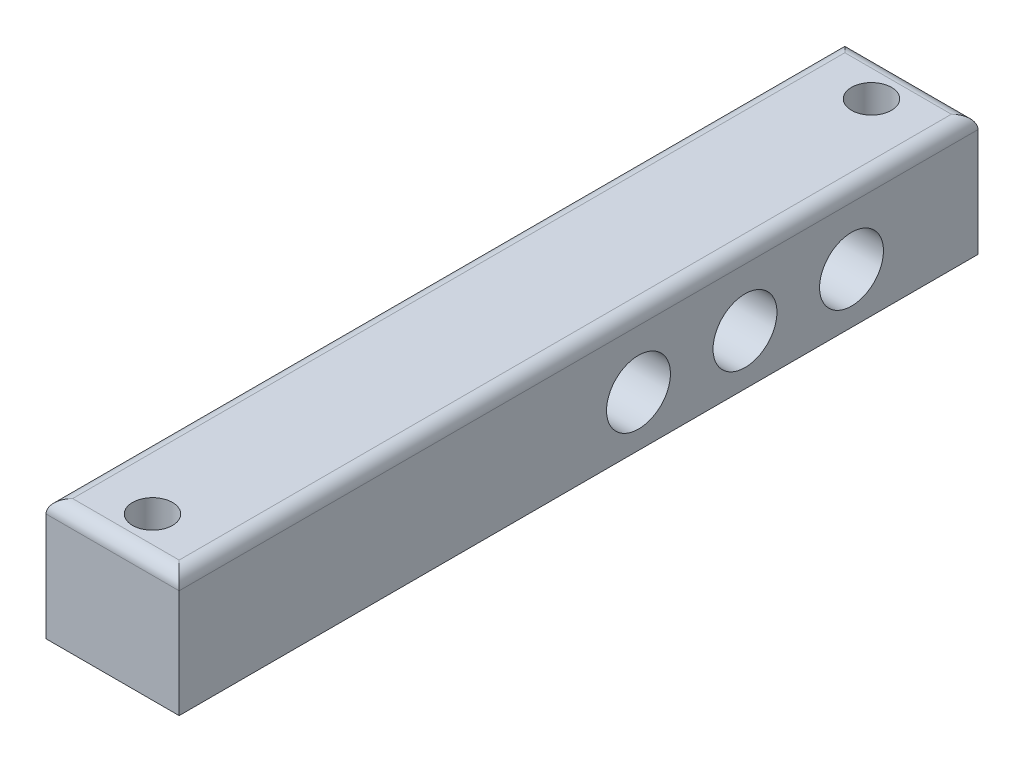
ISO-10303-21;
HEADER;
FILE_DESCRIPTION(('STEP AP214'),'2;1');
FILE_NAME('part.step','',(''),(''),'','','');
FILE_SCHEMA(('AUTOMOTIVE_DESIGN { 1 0 10303 214 1 1 1 1 }'));
ENDSEC;
DATA;
#1=APPLICATION_CONTEXT('core data for automotive mechanical design processes');
#2=APPLICATION_PROTOCOL_DEFINITION('international standard','automotive_design',2000,#1);
#3=PRODUCT_CONTEXT('',#1,'mechanical');
#4=PRODUCT('Part','Part','',(#3));
#5=PRODUCT_RELATED_PRODUCT_CATEGORY('part','',(#4));
#6=PRODUCT_DEFINITION_FORMATION('','',#4);
#7=PRODUCT_DEFINITION_CONTEXT('part definition',#1,'design');
#8=PRODUCT_DEFINITION('design','',#6,#7);
#9=PRODUCT_DEFINITION_SHAPE('','',#8);
#10=(LENGTH_UNIT() NAMED_UNIT(*) SI_UNIT(.MILLI.,.METRE.));
#11=(NAMED_UNIT(*) PLANE_ANGLE_UNIT() SI_UNIT($,.RADIAN.));
#12=(NAMED_UNIT(*) SI_UNIT($,.STERADIAN.) SOLID_ANGLE_UNIT());
#13=UNCERTAINTY_MEASURE_WITH_UNIT(LENGTH_MEASURE(1.E-05),#10,'distance_accuracy_value','');
#14=(GEOMETRIC_REPRESENTATION_CONTEXT(3) GLOBAL_UNCERTAINTY_ASSIGNED_CONTEXT((#13)) GLOBAL_UNIT_ASSIGNED_CONTEXT((#10,
#11,#12)) REPRESENTATION_CONTEXT('',''));
#15=CARTESIAN_POINT('',(0.,0.,0.));
#16=DIRECTION('',(0.,0.,1.));
#17=DIRECTION('',(1.,0.,0.));
#18=AXIS2_PLACEMENT_3D('',#15,#16,#17);
#19=CARTESIAN_POINT('',(-10.,9.12,0.));
#20=DIRECTION('',(1.,0.,0.));
#21=DIRECTION('',(0.,0.,-1.));
#22=AXIS2_PLACEMENT_3D('',#19,#20,#21);
#23=PLANE('',#22);
#24=CARTESIAN_POINT('',(-10.,3.79,25.5));
#25=DIRECTION('',(-1.,0.,0.));
#26=DIRECTION('',(0.,0.,1.));
#27=AXIS2_PLACEMENT_3D('',#24,#25,#26);
#28=CIRCLE('',#27,2.4);
#29=CARTESIAN_POINT('',(-10.,3.79,27.9));
#30=VERTEX_POINT('',#29);
#31=EDGE_CURVE('E159',#30,#30,#28,.T.);
#32=ORIENTED_EDGE('',*,*,#31,.F.);
#33=EDGE_LOOP('',(#32));
#34=FACE_BOUND('',#33,.T.);
#35=CARTESIAN_POINT('',(-10.,3.79,9.5));
#36=DIRECTION('',(-1.,0.,0.));
#37=DIRECTION('',(0.,0.,1.));
#38=AXIS2_PLACEMENT_3D('',#35,#36,#37);
#39=CIRCLE('',#38,2.4);
#40=CARTESIAN_POINT('',(-10.,3.79,11.9));
#41=VERTEX_POINT('',#40);
#42=EDGE_CURVE('E165',#41,#41,#39,.T.);
#43=ORIENTED_EDGE('',*,*,#42,.F.);
#44=EDGE_LOOP('',(#43));
#45=FACE_BOUND('',#44,.T.);
#46=CARTESIAN_POINT('',(-10.,3.79,17.5));
#47=DIRECTION('',(-1.,0.,0.));
#48=DIRECTION('',(0.,0.,1.));
#49=AXIS2_PLACEMENT_3D('',#46,#47,#48);
#50=CIRCLE('',#49,2.4);
#51=CARTESIAN_POINT('',(-10.,3.79,19.9));
#52=VERTEX_POINT('',#51);
#53=EDGE_CURVE('E111',#52,#52,#50,.T.);
#54=ORIENTED_EDGE('',*,*,#53,.F.);
#55=EDGE_LOOP('',(#54));
#56=FACE_BOUND('',#55,.T.);
#57=DIRECTION('',(0.,-1.,0.));
#58=VECTOR('',#57,1.);
#59=CARTESIAN_POINT('',(-9.99999999999999,9.12,60.));
#60=LINE('',#59,#58);
#61=CARTESIAN_POINT('',(-9.99999999999999,8.12,60.));
#62=VERTEX_POINT('',#61);
#63=CARTESIAN_POINT('',(-9.99999999999999,0.,60.));
#64=VERTEX_POINT('',#63);
#65=EDGE_CURVE('E86',#62,#64,#60,.T.);
#66=ORIENTED_EDGE('',*,*,#65,.F.);
#67=DIRECTION('',(0.,0.,1.));
#68=VECTOR('',#67,1.);
#69=CARTESIAN_POINT('',(-10.,8.12,0.));
#70=LINE('',#69,#68);
#71=CARTESIAN_POINT('',(-10.,8.12,0.));
#72=VERTEX_POINT('',#71);
#73=EDGE_CURVE('E11',#62,#72,#70,.F.);
#74=ORIENTED_EDGE('',*,*,#73,.T.);
#75=DIRECTION('',(0.,-1.,0.));
#76=VECTOR('',#75,1.);
#77=CARTESIAN_POINT('',(-10.,9.12,0.));
#78=LINE('',#77,#76);
#79=CARTESIAN_POINT('',(-10.,0.,0.));
#80=VERTEX_POINT('',#79);
#81=EDGE_CURVE('E106',#72,#80,#78,.T.);
#82=ORIENTED_EDGE('',*,*,#81,.T.);
#83=DIRECTION('',(0.,0.,1.));
#84=VECTOR('',#83,1.);
#85=CARTESIAN_POINT('',(-10.,0.,0.));
#86=LINE('',#85,#84);
#87=EDGE_CURVE('E102',#80,#64,#86,.T.);
#88=ORIENTED_EDGE('',*,*,#87,.T.);
#89=EDGE_LOOP('',(#66,#74,#82,#88));
#90=FACE_BOUND('',#89,.T.);
#91=ADVANCED_FACE('F32',(#34,#45,#56,#90),#23,.F.);
#92=CARTESIAN_POINT('',(-9.99999999999999,9.12,60.));
#93=DIRECTION('',(0.,0.,-1.));
#94=DIRECTION('',(-1.,0.,0.));
#95=AXIS2_PLACEMENT_3D('',#92,#93,#94);
#96=PLANE('',#95);
#97=DIRECTION('',(0.,-1.,0.));
#98=VECTOR('',#97,1.);
#99=CARTESIAN_POINT('',(0.,9.12,60.));
#100=LINE('',#99,#98);
#101=CARTESIAN_POINT('',(0.,8.12,60.));
#102=VERTEX_POINT('',#101);
#103=CARTESIAN_POINT('',(0.,0.,60.));
#104=VERTEX_POINT('',#103);
#105=EDGE_CURVE('E96',#102,#104,#100,.T.);
#106=ORIENTED_EDGE('',*,*,#105,.F.);
#107=DIRECTION('',(1.,0.,0.));
#108=VECTOR('',#107,1.);
#109=CARTESIAN_POINT('',(-9.99999999999999,8.12,60.));
#110=LINE('',#109,#108);
#111=EDGE_CURVE('E93',#102,#62,#110,.F.);
#112=ORIENTED_EDGE('',*,*,#111,.T.);
#113=ORIENTED_EDGE('',*,*,#65,.T.);
#114=DIRECTION('',(1.,0.,0.));
#115=VECTOR('',#114,1.);
#116=CARTESIAN_POINT('',(-9.99999999999999,0.,60.));
#117=LINE('',#116,#115);
#118=EDGE_CURVE('E90',#64,#104,#117,.T.);
#119=ORIENTED_EDGE('',*,*,#118,.T.);
#120=EDGE_LOOP('',(#106,#112,#113,#119));
#121=FACE_BOUND('',#120,.T.);
#122=ADVANCED_FACE('F89',(#121),#96,.F.);
#123=CARTESIAN_POINT('',(0.,9.12,0.));
#124=DIRECTION('',(-1.,0.,0.));
#125=DIRECTION('',(0.,0.,1.));
#126=AXIS2_PLACEMENT_3D('',#123,#124,#125);
#127=PLANE('',#126);
#128=CARTESIAN_POINT('',(0.,3.79,25.5));
#129=DIRECTION('',(-1.,0.,0.));
#130=DIRECTION('',(0.,0.,1.));
#131=AXIS2_PLACEMENT_3D('',#128,#129,#130);
#132=CIRCLE('',#131,2.4);
#133=CARTESIAN_POINT('',(0.,3.79,27.9));
#134=VERTEX_POINT('',#133);
#135=EDGE_CURVE('E162',#134,#134,#132,.T.);
#136=ORIENTED_EDGE('',*,*,#135,.T.);
#137=EDGE_LOOP('',(#136));
#138=FACE_BOUND('',#137,.T.);
#139=CARTESIAN_POINT('',(0.,3.79,9.49999999999999));
#140=DIRECTION('',(-1.,0.,0.));
#141=DIRECTION('',(0.,0.,1.));
#142=AXIS2_PLACEMENT_3D('',#139,#140,#141);
#143=CIRCLE('',#142,2.4);
#144=CARTESIAN_POINT('',(0.,3.79,11.9));
#145=VERTEX_POINT('',#144);
#146=EDGE_CURVE('E168',#145,#145,#143,.T.);
#147=ORIENTED_EDGE('',*,*,#146,.T.);
#148=EDGE_LOOP('',(#147));
#149=FACE_BOUND('',#148,.T.);
#150=CARTESIAN_POINT('',(0.,3.79,17.5));
#151=DIRECTION('',(-1.,0.,0.));
#152=DIRECTION('',(0.,0.,1.));
#153=AXIS2_PLACEMENT_3D('',#150,#151,#152);
#154=CIRCLE('',#153,2.4);
#155=CARTESIAN_POINT('',(0.,3.79,19.9));
#156=VERTEX_POINT('',#155);
#157=EDGE_CURVE('E108',#156,#156,#154,.T.);
#158=ORIENTED_EDGE('',*,*,#157,.T.);
#159=EDGE_LOOP('',(#158));
#160=FACE_BOUND('',#159,.T.);
#161=DIRECTION('',(0.,-1.,0.));
#162=VECTOR('',#161,1.);
#163=CARTESIAN_POINT('',(0.,9.12,0.));
#164=LINE('',#163,#162);
#165=CARTESIAN_POINT('',(0.,8.12,0.));
#166=VERTEX_POINT('',#165);
#167=CARTESIAN_POINT('',(0.,0.,0.));
#168=VERTEX_POINT('',#167);
#169=EDGE_CURVE('E119',#166,#168,#164,.T.);
#170=ORIENTED_EDGE('',*,*,#169,.F.);
#171=DIRECTION('',(0.,0.,-1.));
#172=VECTOR('',#171,1.);
#173=CARTESIAN_POINT('',(0.,8.12,60.));
#174=LINE('',#173,#172);
#175=EDGE_CURVE('E41',#166,#102,#174,.F.);
#176=ORIENTED_EDGE('',*,*,#175,.T.);
#177=ORIENTED_EDGE('',*,*,#105,.T.);
#178=DIRECTION('',(0.,0.,-1.));
#179=VECTOR('',#178,1.);
#180=CARTESIAN_POINT('',(0.,0.,0.));
#181=LINE('',#180,#179);
#182=EDGE_CURVE('E104',#104,#168,#181,.T.);
#183=ORIENTED_EDGE('',*,*,#182,.T.);
#184=EDGE_LOOP('',(#170,#176,#177,#183));
#185=FACE_BOUND('',#184,.T.);
#186=ADVANCED_FACE('F206',(#138,#149,#160,#185),#127,.F.);
#187=CARTESIAN_POINT('',(-10.,9.12,0.));
#188=DIRECTION('',(0.,0.,1.));
#189=DIRECTION('',(1.,0.,0.));
#190=AXIS2_PLACEMENT_3D('',#187,#188,#189);
#191=PLANE('',#190);
#192=ORIENTED_EDGE('',*,*,#81,.F.);
#193=DIRECTION('',(-1.,0.,0.));
#194=VECTOR('',#193,1.);
#195=CARTESIAN_POINT('',(0.,8.12,0.));
#196=LINE('',#195,#194);
#197=EDGE_CURVE('E49',#72,#166,#196,.F.);
#198=ORIENTED_EDGE('',*,*,#197,.T.);
#199=ORIENTED_EDGE('',*,*,#169,.T.);
#200=DIRECTION('',(-1.,0.,0.));
#201=VECTOR('',#200,1.);
#202=CARTESIAN_POINT('',(-10.,0.,0.));
#203=LINE('',#202,#201);
#204=EDGE_CURVE('E116',#168,#80,#203,.T.);
#205=ORIENTED_EDGE('',*,*,#204,.T.);
#206=EDGE_LOOP('',(#192,#198,#199,#205));
#207=FACE_BOUND('',#206,.T.);
#208=ADVANCED_FACE('F201',(#207),#191,.F.);
#209=CARTESIAN_POINT('',(0.,9.12,0.));
#210=DIRECTION('',(0.,1.,0.));
#211=DIRECTION('',(0.,0.,1.));
#212=AXIS2_PLACEMENT_3D('',#209,#210,#211);
#213=PLANE('',#212);
#214=DIRECTION('',(1.,0.,0.));
#215=VECTOR('',#214,1.);
#216=CARTESIAN_POINT('',(0.,9.12,59.));
#217=LINE('',#216,#215);
#218=CARTESIAN_POINT('',(-8.99999999999999,9.12,59.));
#219=VERTEX_POINT('',#218);
#220=CARTESIAN_POINT('',(-0.999999999999993,9.12,59.));
#221=VERTEX_POINT('',#220);
#222=EDGE_CURVE('E125',#219,#221,#217,.T.);
#223=ORIENTED_EDGE('',*,*,#222,.T.);
#224=DIRECTION('',(0.,0.,-1.));
#225=VECTOR('',#224,1.);
#226=CARTESIAN_POINT('',(-1.,9.12,0.));
#227=LINE('',#226,#225);
#228=CARTESIAN_POINT('',(-1.,9.12,1.));
#229=VERTEX_POINT('',#228);
#230=EDGE_CURVE('E128',#221,#229,#227,.T.);
#231=ORIENTED_EDGE('',*,*,#230,.T.);
#232=DIRECTION('',(-1.,0.,0.));
#233=VECTOR('',#232,1.);
#234=CARTESIAN_POINT('',(-10.,9.12,1.));
#235=LINE('',#234,#233);
#236=CARTESIAN_POINT('',(-9.,9.12,1.));
#237=VERTEX_POINT('',#236);
#238=EDGE_CURVE('E123',#229,#237,#235,.T.);
#239=ORIENTED_EDGE('',*,*,#238,.T.);
#240=DIRECTION('',(0.,0.,1.));
#241=VECTOR('',#240,1.);
#242=CARTESIAN_POINT('',(-8.99999999999999,9.12,60.));
#243=LINE('',#242,#241);
#244=EDGE_CURVE('E95',#237,#219,#243,.T.);
#245=ORIENTED_EDGE('',*,*,#244,.T.);
#246=EDGE_LOOP('',(#223,#231,#239,#245));
#247=FACE_BOUND('',#246,.T.);
#248=CARTESIAN_POINT('',(-5.,9.12,57.));
#249=DIRECTION('',(0.,1.,0.));
#250=DIRECTION('',(0.,0.,1.));
#251=AXIS2_PLACEMENT_3D('',#248,#249,#250);
#252=CIRCLE('',#251,1.5);
#253=CARTESIAN_POINT('',(-5.,9.12,58.5));
#254=VERTEX_POINT('',#253);
#255=EDGE_CURVE('E143',#254,#254,#252,.T.);
#256=ORIENTED_EDGE('',*,*,#255,.F.);
#257=EDGE_LOOP('',(#256));
#258=FACE_BOUND('',#257,.T.);
#259=CARTESIAN_POINT('',(-5.,9.12,3.));
#260=DIRECTION('',(0.,1.,0.));
#261=DIRECTION('',(0.,0.,1.));
#262=AXIS2_PLACEMENT_3D('',#259,#260,#261);
#263=CIRCLE('',#262,1.5);
#264=CARTESIAN_POINT('',(-5.,9.12,4.5));
#265=VERTEX_POINT('',#264);
#266=EDGE_CURVE('E153',#265,#265,#263,.T.);
#267=ORIENTED_EDGE('',*,*,#266,.F.);
#268=EDGE_LOOP('',(#267));
#269=FACE_BOUND('',#268,.T.);
#270=ADVANCED_FACE('F194',(#247,#258,#269),#213,.T.);
#271=CARTESIAN_POINT('',(0.,0.,0.));
#272=DIRECTION('',(0.,1.,0.));
#273=DIRECTION('',(0.,0.,1.));
#274=AXIS2_PLACEMENT_3D('',#271,#272,#273);
#275=PLANE('',#274);
#276=CARTESIAN_POINT('',(-5.,0.,57.));
#277=DIRECTION('',(0.,1.,0.));
#278=DIRECTION('',(0.,0.,1.));
#279=AXIS2_PLACEMENT_3D('',#276,#277,#278);
#280=CIRCLE('',#279,1.5);
#281=CARTESIAN_POINT('',(-5.,0.,58.5));
#282=VERTEX_POINT('',#281);
#283=EDGE_CURVE('E148',#282,#282,#280,.T.);
#284=ORIENTED_EDGE('',*,*,#283,.T.);
#285=EDGE_LOOP('',(#284));
#286=FACE_BOUND('',#285,.T.);
#287=CARTESIAN_POINT('',(-5.,0.,3.));
#288=DIRECTION('',(0.,1.,0.));
#289=DIRECTION('',(0.,0.,1.));
#290=AXIS2_PLACEMENT_3D('',#287,#288,#289);
#291=CIRCLE('',#290,1.5);
#292=CARTESIAN_POINT('',(-5.,0.,4.5));
#293=VERTEX_POINT('',#292);
#294=EDGE_CURVE('E156',#293,#293,#291,.T.);
#295=ORIENTED_EDGE('',*,*,#294,.T.);
#296=EDGE_LOOP('',(#295));
#297=FACE_BOUND('',#296,.T.);
#298=ORIENTED_EDGE('',*,*,#87,.F.);
#299=ORIENTED_EDGE('',*,*,#204,.F.);
#300=ORIENTED_EDGE('',*,*,#182,.F.);
#301=ORIENTED_EDGE('',*,*,#118,.F.);
#302=EDGE_LOOP('',(#298,#299,#300,#301));
#303=FACE_BOUND('',#302,.T.);
#304=ADVANCED_FACE('F100',(#286,#297,#303),#275,.F.);
#305=CARTESIAN_POINT('',(0.,3.79,17.5));
#306=DIRECTION('',(-1.,0.,0.));
#307=DIRECTION('',(0.,0.,1.));
#308=AXIS2_PLACEMENT_3D('',#305,#306,#307);
#309=CYLINDRICAL_SURFACE('',#308,2.4);
#310=ORIENTED_EDGE('',*,*,#157,.F.);
#311=EDGE_LOOP('',(#310));
#312=FACE_BOUND('',#311,.T.);
#313=ORIENTED_EDGE('',*,*,#53,.T.);
#314=EDGE_LOOP('',(#313));
#315=FACE_BOUND('',#314,.T.);
#316=ADVANCED_FACE('F183',(#312,#315),#309,.F.);
#317=CARTESIAN_POINT('',(0.,3.79,9.49999999999999));
#318=DIRECTION('',(-1.,0.,0.));
#319=DIRECTION('',(0.,0.,1.));
#320=AXIS2_PLACEMENT_3D('',#317,#318,#319);
#321=CYLINDRICAL_SURFACE('',#320,2.4);
#322=ORIENTED_EDGE('',*,*,#146,.F.);
#323=EDGE_LOOP('',(#322));
#324=FACE_BOUND('',#323,.T.);
#325=ORIENTED_EDGE('',*,*,#42,.T.);
#326=EDGE_LOOP('',(#325));
#327=FACE_BOUND('',#326,.T.);
#328=ADVANCED_FACE('F174',(#324,#327),#321,.F.);
#329=CARTESIAN_POINT('',(0.,3.79,25.5));
#330=DIRECTION('',(-1.,0.,0.));
#331=DIRECTION('',(0.,0.,1.));
#332=AXIS2_PLACEMENT_3D('',#329,#330,#331);
#333=CYLINDRICAL_SURFACE('',#332,2.4);
#334=ORIENTED_EDGE('',*,*,#135,.F.);
#335=EDGE_LOOP('',(#334));
#336=FACE_BOUND('',#335,.T.);
#337=ORIENTED_EDGE('',*,*,#31,.T.);
#338=EDGE_LOOP('',(#337));
#339=FACE_BOUND('',#338,.T.);
#340=ADVANCED_FACE('F191',(#336,#339),#333,.F.);
#341=CARTESIAN_POINT('',(-5.,0.,3.));
#342=DIRECTION('',(0.,1.,0.));
#343=DIRECTION('',(0.,0.,1.));
#344=AXIS2_PLACEMENT_3D('',#341,#342,#343);
#345=CYLINDRICAL_SURFACE('',#344,1.5);
#346=ORIENTED_EDGE('',*,*,#294,.F.);
#347=EDGE_LOOP('',(#346));
#348=FACE_BOUND('',#347,.T.);
#349=ORIENTED_EDGE('',*,*,#266,.T.);
#350=EDGE_LOOP('',(#349));
#351=FACE_BOUND('',#350,.T.);
#352=ADVANCED_FACE('F228',(#348,#351),#345,.F.);
#353=CARTESIAN_POINT('',(-5.,0.,57.));
#354=DIRECTION('',(0.,1.,0.));
#355=DIRECTION('',(0.,0.,1.));
#356=AXIS2_PLACEMENT_3D('',#353,#354,#355);
#357=CYLINDRICAL_SURFACE('',#356,1.5);
#358=ORIENTED_EDGE('',*,*,#283,.F.);
#359=EDGE_LOOP('',(#358));
#360=FACE_BOUND('',#359,.T.);
#361=ORIENTED_EDGE('',*,*,#255,.T.);
#362=EDGE_LOOP('',(#361));
#363=FACE_BOUND('',#362,.T.);
#364=ADVANCED_FACE('F223',(#360,#363),#357,.F.);
#365=CARTESIAN_POINT('',(0.,8.12,1.));
#366=DIRECTION('',(1.,0.,0.));
#367=DIRECTION('',(0.,0.,-1.));
#368=AXIS2_PLACEMENT_3D('',#365,#366,#367);
#369=CYLINDRICAL_SURFACE('',#368,1.);
#370=CARTESIAN_POINT('',(-1.,8.12,1.));
#371=DIRECTION('',(0.707106781186548,0.,0.707106781186547));
#372=DIRECTION('',(-0.707106781186547,0.,0.707106781186548));
#373=AXIS2_PLACEMENT_3D('',#370,#371,#372);
#374=ELLIPSE('',#373,1.41421356237309,1.);
#375=EDGE_CURVE('E136',#166,#229,#374,.T.);
#376=ORIENTED_EDGE('',*,*,#375,.F.);
#377=ORIENTED_EDGE('',*,*,#197,.F.);
#378=CARTESIAN_POINT('',(-9.,8.12,1.));
#379=DIRECTION('',(0.707106781186547,0.,-0.707106781186548));
#380=DIRECTION('',(-0.707106781186548,0.,-0.707106781186547));
#381=AXIS2_PLACEMENT_3D('',#378,#379,#380);
#382=ELLIPSE('',#381,1.4142135623731,1.);
#383=EDGE_CURVE('E36',#237,#72,#382,.F.);
#384=ORIENTED_EDGE('',*,*,#383,.F.);
#385=ORIENTED_EDGE('',*,*,#238,.F.);
#386=EDGE_LOOP('',(#376,#377,#384,#385));
#387=FACE_BOUND('',#386,.T.);
#388=ADVANCED_FACE('F34',(#387),#369,.T.);
#389=CARTESIAN_POINT('',(-9.,8.12,0.));
#390=DIRECTION('',(0.,0.,-1.));
#391=DIRECTION('',(-1.,0.,0.));
#392=AXIS2_PLACEMENT_3D('',#389,#390,#391);
#393=CYLINDRICAL_SURFACE('',#392,1.);
#394=ORIENTED_EDGE('',*,*,#383,.T.);
#395=ORIENTED_EDGE('',*,*,#73,.F.);
#396=CARTESIAN_POINT('',(-8.99999999999999,8.12,59.));
#397=DIRECTION('',(-0.707106781186548,0.,-0.707106781186547));
#398=DIRECTION('',(0.707106781186547,0.,-0.707106781186548));
#399=AXIS2_PLACEMENT_3D('',#396,#397,#398);
#400=ELLIPSE('',#399,1.41421356237309,1.);
#401=EDGE_CURVE('E135',#219,#62,#400,.F.);
#402=ORIENTED_EDGE('',*,*,#401,.F.);
#403=ORIENTED_EDGE('',*,*,#244,.F.);
#404=EDGE_LOOP('',(#394,#395,#402,#403));
#405=FACE_BOUND('',#404,.T.);
#406=ADVANCED_FACE('F218',(#405),#393,.T.);
#407=CARTESIAN_POINT('',(-1.,8.12,0.));
#408=DIRECTION('',(0.,0.,1.));
#409=DIRECTION('',(1.,0.,0.));
#410=AXIS2_PLACEMENT_3D('',#407,#408,#409);
#411=CYLINDRICAL_SURFACE('',#410,1.);
#412=ORIENTED_EDGE('',*,*,#375,.T.);
#413=ORIENTED_EDGE('',*,*,#230,.F.);
#414=CARTESIAN_POINT('',(-0.999999999999993,8.12,59.));
#415=DIRECTION('',(-0.707106781186547,0.,0.707106781186548));
#416=DIRECTION('',(0.707106781186548,0.,0.707106781186547));
#417=AXIS2_PLACEMENT_3D('',#414,#415,#416);
#418=ELLIPSE('',#417,1.4142135623731,1.);
#419=EDGE_CURVE('E133',#102,#221,#418,.T.);
#420=ORIENTED_EDGE('',*,*,#419,.F.);
#421=ORIENTED_EDGE('',*,*,#175,.F.);
#422=EDGE_LOOP('',(#412,#413,#420,#421));
#423=FACE_BOUND('',#422,.T.);
#424=ADVANCED_FACE('F215',(#423),#411,.T.);
#425=CARTESIAN_POINT('',(0.,8.12,59.));
#426=DIRECTION('',(-1.,0.,0.));
#427=DIRECTION('',(0.,0.,1.));
#428=AXIS2_PLACEMENT_3D('',#425,#426,#427);
#429=CYLINDRICAL_SURFACE('',#428,1.);
#430=ORIENTED_EDGE('',*,*,#401,.T.);
#431=ORIENTED_EDGE('',*,*,#111,.F.);
#432=ORIENTED_EDGE('',*,*,#419,.T.);
#433=ORIENTED_EDGE('',*,*,#222,.F.);
#434=EDGE_LOOP('',(#430,#431,#432,#433));
#435=FACE_BOUND('',#434,.T.);
#436=ADVANCED_FACE('F212',(#435),#429,.T.);
#437=CLOSED_SHELL('',(#91,#122,#186,#208,#270,#304,#316,#328,#340,#352,#364,#388,#406,#424,#436));
#438=MANIFOLD_SOLID_BREP('B2',#437);
#439=ADVANCED_BREP_SHAPE_REPRESENTATION('',(#18,#438),#14);
#440=SHAPE_DEFINITION_REPRESENTATION(#9,#439);
ENDSEC;
END-ISO-10303-21;
